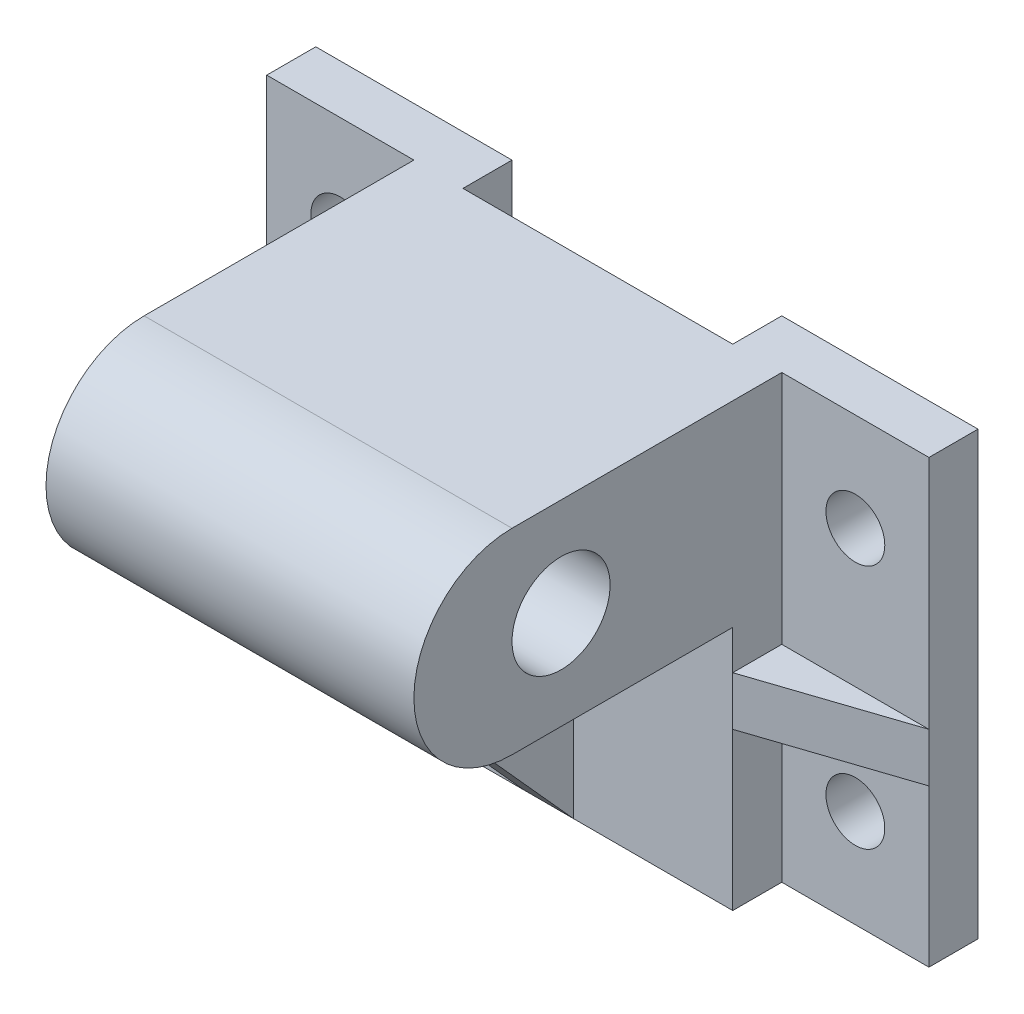
ISO-10303-21;
HEADER;
FILE_DESCRIPTION(('STEP AP214'),'2;1');
FILE_NAME('part.step','',(''),(''),'','','');
FILE_SCHEMA(('AUTOMOTIVE_DESIGN { 1 0 10303 214 1 1 1 1 }'));
ENDSEC;
DATA;
#1=APPLICATION_CONTEXT('core data for automotive mechanical design processes');
#2=APPLICATION_PROTOCOL_DEFINITION('international standard','automotive_design',2000,#1);
#3=PRODUCT_CONTEXT('',#1,'mechanical');
#4=PRODUCT('Part','Part','',(#3));
#5=PRODUCT_RELATED_PRODUCT_CATEGORY('part','',(#4));
#6=PRODUCT_DEFINITION_FORMATION('','',#4);
#7=PRODUCT_DEFINITION_CONTEXT('part definition',#1,'design');
#8=PRODUCT_DEFINITION('design','',#6,#7);
#9=PRODUCT_DEFINITION_SHAPE('','',#8);
#10=(LENGTH_UNIT() NAMED_UNIT(*) SI_UNIT(.MILLI.,.METRE.));
#11=(NAMED_UNIT(*) PLANE_ANGLE_UNIT() SI_UNIT($,.RADIAN.));
#12=(NAMED_UNIT(*) SI_UNIT($,.STERADIAN.) SOLID_ANGLE_UNIT());
#13=UNCERTAINTY_MEASURE_WITH_UNIT(LENGTH_MEASURE(1.E-05),#10,'distance_accuracy_value','');
#14=(GEOMETRIC_REPRESENTATION_CONTEXT(3) GLOBAL_UNCERTAINTY_ASSIGNED_CONTEXT((#13)) GLOBAL_UNIT_ASSIGNED_CONTEXT((#10,
#11,#12)) REPRESENTATION_CONTEXT('',''));
#15=CARTESIAN_POINT('',(0.,0.,0.));
#16=DIRECTION('',(0.,0.,1.));
#17=DIRECTION('',(1.,0.,0.));
#18=AXIS2_PLACEMENT_3D('',#15,#16,#17);
#19=CARTESIAN_POINT('',(-37.5,-45.,10.));
#20=DIRECTION('',(1.,0.,0.));
#21=DIRECTION('',(0.,0.,-1.));
#22=AXIS2_PLACEMENT_3D('',#19,#20,#21);
#23=PLANE('',#22);
#24=CARTESIAN_POINT('',(-37.5,25.,45.));
#25=DIRECTION('',(-1.,0.,0.));
#26=DIRECTION('',(0.,0.,1.));
#27=AXIS2_PLACEMENT_3D('',#24,#25,#26);
#28=CIRCLE('',#27,10.);
#29=CARTESIAN_POINT('',(-37.5,25.,55.));
#30=VERTEX_POINT('',#29);
#31=EDGE_CURVE('E297',#30,#30,#28,.T.);
#32=ORIENTED_EDGE('',*,*,#31,.F.);
#33=EDGE_LOOP('',(#32));
#34=FACE_BOUND('',#33,.T.);
#35=DIRECTION('',(0.,0.,-1.));
#36=VECTOR('',#35,1.);
#37=CARTESIAN_POINT('',(-37.5,-3.,10.));
#38=LINE('',#37,#36);
#39=CARTESIAN_POINT('',(-37.5,-3.00000000000002,10.));
#40=VERTEX_POINT('',#39);
#41=CARTESIAN_POINT('',(-37.5,-3.00000000000002,0.));
#42=VERTEX_POINT('',#41);
#43=EDGE_CURVE('E56',#40,#42,#38,.T.);
#44=ORIENTED_EDGE('',*,*,#43,.F.);
#45=DIRECTION('',(0.,-1.,0.));
#46=VECTOR('',#45,1.);
#47=CARTESIAN_POINT('',(-37.5,-45.,10.));
#48=LINE('',#47,#46);
#49=CARTESIAN_POINT('',(-37.5,4.99999999999998,10.));
#50=VERTEX_POINT('',#49);
#51=EDGE_CURVE('E393',#50,#40,#48,.T.);
#52=ORIENTED_EDGE('',*,*,#51,.F.);
#53=DIRECTION('',(0.,0.,-1.));
#54=VECTOR('',#53,1.);
#55=CARTESIAN_POINT('',(-37.5,5.,55.));
#56=LINE('',#55,#54);
#57=CARTESIAN_POINT('',(-37.5,5.,55.));
#58=VERTEX_POINT('',#57);
#59=EDGE_CURVE('E385',#58,#50,#56,.T.);
#60=ORIENTED_EDGE('',*,*,#59,.F.);
#61=CARTESIAN_POINT('',(-37.5,25.,55.));
#62=DIRECTION('',(-1.,0.,0.));
#63=DIRECTION('',(0.,0.,1.));
#64=AXIS2_PLACEMENT_3D('',#61,#62,#63);
#65=CIRCLE('',#64,20.);
#66=CARTESIAN_POINT('',(-37.5,45.,55.));
#67=VERTEX_POINT('',#66);
#68=EDGE_CURVE('E301',#58,#67,#65,.T.);
#69=ORIENTED_EDGE('',*,*,#68,.T.);
#70=DIRECTION('',(0.,0.,-1.));
#71=VECTOR('',#70,1.);
#72=CARTESIAN_POINT('',(-37.5,45.,10.));
#73=LINE('',#72,#71);
#74=CARTESIAN_POINT('',(-37.5,45.,0.));
#75=VERTEX_POINT('',#74);
#76=EDGE_CURVE('E41',#67,#75,#73,.T.);
#77=ORIENTED_EDGE('',*,*,#76,.T.);
#78=DIRECTION('',(0.,-1.,0.));
#79=VECTOR('',#78,1.);
#80=CARTESIAN_POINT('',(-37.5,-45.,0.));
#81=LINE('',#80,#79);
#82=EDGE_CURVE('E311',#75,#42,#81,.T.);
#83=ORIENTED_EDGE('',*,*,#82,.T.);
#84=EDGE_LOOP('',(#44,#52,#60,#69,#77,#83));
#85=FACE_BOUND('',#84,.T.);
#86=ADVANCED_FACE('F33',(#34,#85),#23,.F.);
#87=CARTESIAN_POINT('',(-67.5,-45.,0.));
#88=DIRECTION('',(0.,0.,1.));
#89=DIRECTION('',(0.,-1.,0.));
#90=AXIS2_PLACEMENT_3D('',#87,#88,#89);
#91=PLANE('',#90);
#92=CARTESIAN_POINT('',(-52.5,25.,0.));
#93=DIRECTION('',(0.,0.,1.));
#94=DIRECTION('',(1.,0.,0.));
#95=AXIS2_PLACEMENT_3D('',#92,#93,#94);
#96=CIRCLE('',#95,6.);
#97=CARTESIAN_POINT('',(-46.5,25.,0.));
#98=VERTEX_POINT('',#97);
#99=EDGE_CURVE('E277',#98,#98,#96,.T.);
#100=ORIENTED_EDGE('',*,*,#99,.F.);
#101=EDGE_LOOP('',(#100));
#102=FACE_BOUND('',#101,.T.);
#103=DIRECTION('',(0.,-1.,0.));
#104=VECTOR('',#103,1.);
#105=CARTESIAN_POINT('',(-67.5,-45.,0.));
#106=LINE('',#105,#104);
#107=CARTESIAN_POINT('',(-67.5,45.,0.));
#108=VERTEX_POINT('',#107);
#109=CARTESIAN_POINT('',(-67.5,-3.00000000000002,0.));
#110=VERTEX_POINT('',#109);
#111=EDGE_CURVE('E202',#108,#110,#106,.T.);
#112=ORIENTED_EDGE('',*,*,#111,.T.);
#113=DIRECTION('',(1.,0.,0.));
#114=VECTOR('',#113,1.);
#115=CARTESIAN_POINT('',(-67.5,-3.,0.));
#116=LINE('',#115,#114);
#117=EDGE_CURVE('E226',#110,#42,#116,.T.);
#118=ORIENTED_EDGE('',*,*,#117,.T.);
#119=ORIENTED_EDGE('',*,*,#82,.F.);
#120=DIRECTION('',(1.,0.,0.));
#121=VECTOR('',#120,1.);
#122=CARTESIAN_POINT('',(-67.5,45.,0.));
#123=LINE('',#122,#121);
#124=EDGE_CURVE('E316',#108,#75,#123,.T.);
#125=ORIENTED_EDGE('',*,*,#124,.F.);
#126=EDGE_LOOP('',(#112,#118,#119,#125));
#127=FACE_BOUND('',#126,.T.);
#128=ADVANCED_FACE('F417',(#102,#127),#91,.T.);
#129=CARTESIAN_POINT('',(37.5,-45.,10.));
#130=DIRECTION('',(-1.,0.,0.));
#131=DIRECTION('',(0.,0.,1.));
#132=AXIS2_PLACEMENT_3D('',#129,#130,#131);
#133=PLANE('',#132);
#134=CARTESIAN_POINT('',(37.5,25.,45.));
#135=DIRECTION('',(-1.,0.,0.));
#136=DIRECTION('',(0.,0.,1.));
#137=AXIS2_PLACEMENT_3D('',#134,#135,#136);
#138=CIRCLE('',#137,10.);
#139=CARTESIAN_POINT('',(37.5,25.,55.));
#140=VERTEX_POINT('',#139);
#141=EDGE_CURVE('E298',#140,#140,#138,.T.);
#142=ORIENTED_EDGE('',*,*,#141,.T.);
#143=EDGE_LOOP('',(#142));
#144=FACE_BOUND('',#143,.T.);
#145=DIRECTION('',(0.,0.,1.));
#146=VECTOR('',#145,1.);
#147=CARTESIAN_POINT('',(37.5,-3.,10.));
#148=LINE('',#147,#146);
#149=CARTESIAN_POINT('',(37.5,-3.,0.));
#150=VERTEX_POINT('',#149);
#151=CARTESIAN_POINT('',(37.5,-3.,10.));
#152=VERTEX_POINT('',#151);
#153=EDGE_CURVE('E238',#150,#152,#148,.T.);
#154=ORIENTED_EDGE('',*,*,#153,.F.);
#155=DIRECTION('',(0.,-1.,0.));
#156=VECTOR('',#155,1.);
#157=CARTESIAN_POINT('',(37.5,-45.,0.));
#158=LINE('',#157,#156);
#159=CARTESIAN_POINT('',(37.5,45.,0.));
#160=VERTEX_POINT('',#159);
#161=EDGE_CURVE('E325',#160,#150,#158,.T.);
#162=ORIENTED_EDGE('',*,*,#161,.F.);
#163=DIRECTION('',(0.,0.,-1.));
#164=VECTOR('',#163,1.);
#165=CARTESIAN_POINT('',(37.5,45.,10.));
#166=LINE('',#165,#164);
#167=CARTESIAN_POINT('',(37.5,45.,55.));
#168=VERTEX_POINT('',#167);
#169=EDGE_CURVE('E11',#168,#160,#166,.T.);
#170=ORIENTED_EDGE('',*,*,#169,.F.);
#171=CARTESIAN_POINT('',(37.5,25.,55.));
#172=DIRECTION('',(-1.,0.,0.));
#173=DIRECTION('',(0.,0.,1.));
#174=AXIS2_PLACEMENT_3D('',#171,#172,#173);
#175=CIRCLE('',#174,20.);
#176=CARTESIAN_POINT('',(37.5,5.,55.));
#177=VERTEX_POINT('',#176);
#178=EDGE_CURVE('E304',#177,#168,#175,.T.);
#179=ORIENTED_EDGE('',*,*,#178,.F.);
#180=DIRECTION('',(0.,0.,-1.));
#181=VECTOR('',#180,1.);
#182=CARTESIAN_POINT('',(37.5,5.,55.));
#183=LINE('',#182,#181);
#184=CARTESIAN_POINT('',(37.5,5.,10.));
#185=VERTEX_POINT('',#184);
#186=EDGE_CURVE('E379',#177,#185,#183,.T.);
#187=ORIENTED_EDGE('',*,*,#186,.T.);
#188=DIRECTION('',(0.,1.,0.));
#189=VECTOR('',#188,1.);
#190=CARTESIAN_POINT('',(37.5,-45.,10.));
#191=LINE('',#190,#189);
#192=EDGE_CURVE('E392',#152,#185,#191,.T.);
#193=ORIENTED_EDGE('',*,*,#192,.F.);
#194=EDGE_LOOP('',(#154,#162,#170,#179,#187,#193));
#195=FACE_BOUND('',#194,.T.);
#196=ADVANCED_FACE('F435',(#144,#195),#133,.F.);
#197=CARTESIAN_POINT('',(67.5,-45.,0.));
#198=DIRECTION('',(0.,0.,-1.));
#199=DIRECTION('',(0.,1.,0.));
#200=AXIS2_PLACEMENT_3D('',#197,#198,#199);
#201=PLANE('',#200);
#202=CARTESIAN_POINT('',(52.5,25.,0.));
#203=DIRECTION('',(0.,0.,1.));
#204=DIRECTION('',(1.,0.,0.));
#205=AXIS2_PLACEMENT_3D('',#202,#203,#204);
#206=CIRCLE('',#205,6.);
#207=CARTESIAN_POINT('',(58.5,25.,0.));
#208=VERTEX_POINT('',#207);
#209=EDGE_CURVE('E274',#208,#208,#206,.T.);
#210=ORIENTED_EDGE('',*,*,#209,.F.);
#211=EDGE_LOOP('',(#210));
#212=FACE_BOUND('',#211,.T.);
#213=DIRECTION('',(-1.,0.,0.));
#214=VECTOR('',#213,1.);
#215=CARTESIAN_POINT('',(67.5,-3.,0.));
#216=LINE('',#215,#214);
#217=CARTESIAN_POINT('',(67.5,-3.,0.));
#218=VERTEX_POINT('',#217);
#219=EDGE_CURVE('E242',#218,#150,#216,.T.);
#220=ORIENTED_EDGE('',*,*,#219,.F.);
#221=DIRECTION('',(0.,-1.,0.));
#222=VECTOR('',#221,1.);
#223=CARTESIAN_POINT('',(67.5,-45.,0.));
#224=LINE('',#223,#222);
#225=CARTESIAN_POINT('',(67.5,45.,0.));
#226=VERTEX_POINT('',#225);
#227=EDGE_CURVE('E328',#226,#218,#224,.T.);
#228=ORIENTED_EDGE('',*,*,#227,.F.);
#229=DIRECTION('',(-1.,0.,0.));
#230=VECTOR('',#229,1.);
#231=CARTESIAN_POINT('',(67.5,45.,0.));
#232=LINE('',#231,#230);
#233=EDGE_CURVE('E339',#226,#160,#232,.T.);
#234=ORIENTED_EDGE('',*,*,#233,.T.);
#235=ORIENTED_EDGE('',*,*,#161,.T.);
#236=EDGE_LOOP('',(#220,#228,#234,#235));
#237=FACE_BOUND('',#236,.T.);
#238=ADVANCED_FACE('F464',(#212,#237),#201,.F.);
#239=CARTESIAN_POINT('',(0.,0.,10.));
#240=DIRECTION('',(0.,0.,-1.));
#241=DIRECTION('',(-1.,0.,0.));
#242=AXIS2_PLACEMENT_3D('',#239,#240,#241);
#243=PLANE('',#242);
#244=CARTESIAN_POINT('',(37.5,-45.,10.));
#245=VERTEX_POINT('',#244);
#246=CARTESIAN_POINT('',(37.5,-13.,10.));
#247=VERTEX_POINT('',#246);
#248=EDGE_CURVE('E389',#245,#247,#191,.T.);
#249=ORIENTED_EDGE('',*,*,#248,.T.);
#250=DIRECTION('',(0.,1.,0.));
#251=VECTOR('',#250,1.);
#252=CARTESIAN_POINT('',(37.5,-45.,10.));
#253=LINE('',#252,#251);
#254=EDGE_CURVE('E253',#247,#152,#253,.T.);
#255=ORIENTED_EDGE('',*,*,#254,.T.);
#256=ORIENTED_EDGE('',*,*,#192,.T.);
#257=DIRECTION('',(1.,0.,0.));
#258=VECTOR('',#257,1.);
#259=CARTESIAN_POINT('',(-37.5,5.,10.));
#260=LINE('',#259,#258);
#261=CARTESIAN_POINT('',(5.,4.99999999999998,10.));
#262=VERTEX_POINT('',#261);
#263=EDGE_CURVE('E371',#262,#185,#260,.T.);
#264=ORIENTED_EDGE('',*,*,#263,.F.);
#265=DIRECTION('',(0.,1.,0.));
#266=VECTOR('',#265,1.);
#267=CARTESIAN_POINT('',(5.,0.,10.));
#268=LINE('',#267,#266);
#269=CARTESIAN_POINT('',(5.,-45.,10.));
#270=VERTEX_POINT('',#269);
#271=EDGE_CURVE('E260',#270,#262,#268,.T.);
#272=ORIENTED_EDGE('',*,*,#271,.F.);
#273=DIRECTION('',(1.,0.,0.));
#274=VECTOR('',#273,1.);
#275=CARTESIAN_POINT('',(-37.5,-45.,10.));
#276=LINE('',#275,#274);
#277=EDGE_CURVE('E395',#270,#245,#276,.T.);
#278=ORIENTED_EDGE('',*,*,#277,.T.);
#279=EDGE_LOOP('',(#249,#255,#256,#264,#272,#278));
#280=FACE_BOUND('',#279,.T.);
#281=ADVANCED_FACE('F455',(#280),#243,.F.);
#282=CARTESIAN_POINT('',(-37.5,5.,55.));
#283=DIRECTION('',(0.,1.,0.));
#284=DIRECTION('',(0.,0.,1.));
#285=AXIS2_PLACEMENT_3D('',#282,#283,#284);
#286=PLANE('',#285);
#287=DIRECTION('',(0.,0.,1.));
#288=VECTOR('',#287,1.);
#289=CARTESIAN_POINT('',(5.,5.,55.));
#290=LINE('',#289,#288);
#291=CARTESIAN_POINT('',(5.,5.,55.));
#292=VERTEX_POINT('',#291);
#293=EDGE_CURVE('E263',#262,#292,#290,.T.);
#294=ORIENTED_EDGE('',*,*,#293,.F.);
#295=ORIENTED_EDGE('',*,*,#263,.T.);
#296=ORIENTED_EDGE('',*,*,#186,.F.);
#297=DIRECTION('',(1.,0.,0.));
#298=VECTOR('',#297,1.);
#299=CARTESIAN_POINT('',(-37.5,5.,55.));
#300=LINE('',#299,#298);
#301=EDGE_CURVE('E377',#292,#177,#300,.T.);
#302=ORIENTED_EDGE('',*,*,#301,.F.);
#303=EDGE_LOOP('',(#294,#295,#296,#302));
#304=FACE_BOUND('',#303,.T.);
#305=ADVANCED_FACE('F463',(#304),#286,.F.);
#306=CARTESIAN_POINT('',(37.5,-13.,0.));
#307=VERTEX_POINT('',#306);
#308=CARTESIAN_POINT('',(37.5,-45.,0.));
#309=VERTEX_POINT('',#308);
#310=EDGE_CURVE('E321',#307,#309,#158,.T.);
#311=ORIENTED_EDGE('',*,*,#310,.F.);
#312=DIRECTION('',(0.,0.,1.));
#313=VECTOR('',#312,1.);
#314=CARTESIAN_POINT('',(37.5,-13.,10.));
#315=LINE('',#314,#313);
#316=EDGE_CURVE('E244',#307,#247,#315,.T.);
#317=ORIENTED_EDGE('',*,*,#316,.T.);
#318=ORIENTED_EDGE('',*,*,#248,.F.);
#319=DIRECTION('',(0.,0.,-1.));
#320=VECTOR('',#319,1.);
#321=CARTESIAN_POINT('',(37.5,-45.,10.));
#322=LINE('',#321,#320);
#323=EDGE_CURVE('E399',#245,#309,#322,.T.);
#324=ORIENTED_EDGE('',*,*,#323,.T.);
#325=EDGE_LOOP('',(#311,#317,#318,#324));
#326=FACE_BOUND('',#325,.T.);
#327=ADVANCED_FACE('F35',(#326),#133,.F.);
#328=CARTESIAN_POINT('',(0.,0.,0.));
#329=DIRECTION('',(0.,0.,-1.));
#330=DIRECTION('',(-1.,0.,0.));
#331=AXIS2_PLACEMENT_3D('',#328,#329,#330);
#332=PLANE('',#331);
#333=DIRECTION('',(1.,0.,0.));
#334=VECTOR('',#333,1.);
#335=CARTESIAN_POINT('',(-37.5,-45.,0.));
#336=LINE('',#335,#334);
#337=CARTESIAN_POINT('',(-27.5,-45.,0.));
#338=VERTEX_POINT('',#337);
#339=CARTESIAN_POINT('',(27.5,-45.,0.));
#340=VERTEX_POINT('',#339);
#341=EDGE_CURVE('E401',#338,#340,#336,.T.);
#342=ORIENTED_EDGE('',*,*,#341,.F.);
#343=DIRECTION('',(0.,-1.,0.));
#344=VECTOR('',#343,1.);
#345=CARTESIAN_POINT('',(-27.5,45.,0.));
#346=LINE('',#345,#344);
#347=CARTESIAN_POINT('',(-27.5,45.,0.));
#348=VERTEX_POINT('',#347);
#349=EDGE_CURVE('E342',#348,#338,#346,.T.);
#350=ORIENTED_EDGE('',*,*,#349,.F.);
#351=DIRECTION('',(-1.,0.,0.));
#352=VECTOR('',#351,1.);
#353=CARTESIAN_POINT('',(-37.5,45.,0.));
#354=LINE('',#353,#352);
#355=CARTESIAN_POINT('',(27.5,45.,0.));
#356=VERTEX_POINT('',#355);
#357=EDGE_CURVE('E388',#356,#348,#354,.T.);
#358=ORIENTED_EDGE('',*,*,#357,.F.);
#359=DIRECTION('',(0.,1.,0.));
#360=VECTOR('',#359,1.);
#361=CARTESIAN_POINT('',(27.5,45.,0.));
#362=LINE('',#361,#360);
#363=EDGE_CURVE('E356',#340,#356,#362,.T.);
#364=ORIENTED_EDGE('',*,*,#363,.F.);
#365=EDGE_LOOP('',(#342,#350,#358,#364));
#366=FACE_BOUND('',#365,.T.);
#367=ADVANCED_FACE('F452',(#366),#332,.T.);
#368=DIRECTION('',(0.,1.,0.));
#369=VECTOR('',#368,1.);
#370=CARTESIAN_POINT('',(-5.,0.,10.));
#371=LINE('',#370,#369);
#372=CARTESIAN_POINT('',(-5.,-45.,10.));
#373=VERTEX_POINT('',#372);
#374=CARTESIAN_POINT('',(-5.,4.99999999999998,10.));
#375=VERTEX_POINT('',#374);
#376=EDGE_CURVE('E266',#373,#375,#371,.T.);
#377=ORIENTED_EDGE('',*,*,#376,.T.);
#378=EDGE_CURVE('E380',#50,#375,#260,.T.);
#379=ORIENTED_EDGE('',*,*,#378,.F.);
#380=ORIENTED_EDGE('',*,*,#51,.T.);
#381=DIRECTION('',(0.,1.,0.));
#382=VECTOR('',#381,1.);
#383=CARTESIAN_POINT('',(-37.5,-45.,10.));
#384=LINE('',#383,#382);
#385=CARTESIAN_POINT('',(-37.5,-13.,10.));
#386=VERTEX_POINT('',#385);
#387=EDGE_CURVE('E223',#40,#386,#384,.F.);
#388=ORIENTED_EDGE('',*,*,#387,.T.);
#389=CARTESIAN_POINT('',(-37.5,-45.,10.));
#390=VERTEX_POINT('',#389);
#391=EDGE_CURVE('E48',#386,#390,#48,.T.);
#392=ORIENTED_EDGE('',*,*,#391,.T.);
#393=EDGE_CURVE('E396',#390,#373,#276,.T.);
#394=ORIENTED_EDGE('',*,*,#393,.T.);
#395=EDGE_LOOP('',(#377,#379,#380,#388,#392,#394));
#396=FACE_BOUND('',#395,.T.);
#397=ADVANCED_FACE('F448',(#396),#243,.F.);
#398=CARTESIAN_POINT('',(-37.5,45.,10.));
#399=DIRECTION('',(0.,-1.,0.));
#400=DIRECTION('',(0.,0.,-1.));
#401=AXIS2_PLACEMENT_3D('',#398,#399,#400);
#402=PLANE('',#401);
#403=ORIENTED_EDGE('',*,*,#76,.F.);
#404=DIRECTION('',(-1.,0.,0.));
#405=VECTOR('',#404,1.);
#406=CARTESIAN_POINT('',(-37.5,45.,55.));
#407=LINE('',#406,#405);
#408=EDGE_CURVE('E375',#168,#67,#407,.T.);
#409=ORIENTED_EDGE('',*,*,#408,.F.);
#410=ORIENTED_EDGE('',*,*,#169,.T.);
#411=ORIENTED_EDGE('',*,*,#233,.F.);
#412=DIRECTION('',(0.,0.,1.));
#413=VECTOR('',#412,1.);
#414=CARTESIAN_POINT('',(67.5,45.,-10.));
#415=LINE('',#414,#413);
#416=CARTESIAN_POINT('',(67.5,45.,-10.));
#417=VERTEX_POINT('',#416);
#418=EDGE_CURVE('E324',#417,#226,#415,.T.);
#419=ORIENTED_EDGE('',*,*,#418,.F.);
#420=DIRECTION('',(1.,0.,0.));
#421=VECTOR('',#420,1.);
#422=CARTESIAN_POINT('',(37.5,45.,-10.));
#423=LINE('',#422,#421);
#424=CARTESIAN_POINT('',(27.5,45.,-10.));
#425=VERTEX_POINT('',#424);
#426=EDGE_CURVE('E361',#425,#417,#423,.T.);
#427=ORIENTED_EDGE('',*,*,#426,.F.);
#428=DIRECTION('',(0.,0.,1.));
#429=VECTOR('',#428,1.);
#430=CARTESIAN_POINT('',(27.5,45.,-10.));
#431=LINE('',#430,#429);
#432=EDGE_CURVE('E364',#425,#356,#431,.T.);
#433=ORIENTED_EDGE('',*,*,#432,.T.);
#434=ORIENTED_EDGE('',*,*,#357,.T.);
#435=DIRECTION('',(0.,0.,1.));
#436=VECTOR('',#435,1.);
#437=CARTESIAN_POINT('',(-27.5,45.,-10.));
#438=LINE('',#437,#436);
#439=CARTESIAN_POINT('',(-27.5,45.,-10.));
#440=VERTEX_POINT('',#439);
#441=EDGE_CURVE('E353',#440,#348,#438,.T.);
#442=ORIENTED_EDGE('',*,*,#441,.F.);
#443=DIRECTION('',(1.,0.,0.));
#444=VECTOR('',#443,1.);
#445=CARTESIAN_POINT('',(-37.5,45.,-10.));
#446=LINE('',#445,#444);
#447=CARTESIAN_POINT('',(-67.5,45.,-10.));
#448=VERTEX_POINT('',#447);
#449=EDGE_CURVE('E343',#448,#440,#446,.T.);
#450=ORIENTED_EDGE('',*,*,#449,.F.);
#451=DIRECTION('',(0.,0.,1.));
#452=VECTOR('',#451,1.);
#453=CARTESIAN_POINT('',(-67.5,45.,-10.));
#454=LINE('',#453,#452);
#455=EDGE_CURVE('E313',#448,#108,#454,.T.);
#456=ORIENTED_EDGE('',*,*,#455,.T.);
#457=ORIENTED_EDGE('',*,*,#124,.T.);
#458=EDGE_LOOP('',(#403,#409,#410,#411,#419,#427,#433,#434,#442,#450,#456,#457));
#459=FACE_BOUND('',#458,.T.);
#460=ADVANCED_FACE('F413',(#459),#402,.F.);
#461=ORIENTED_EDGE('',*,*,#391,.F.);
#462=DIRECTION('',(0.,0.,-1.));
#463=VECTOR('',#462,1.);
#464=CARTESIAN_POINT('',(-37.5,-13.,10.));
#465=LINE('',#464,#463);
#466=CARTESIAN_POINT('',(-37.5,-13.,0.));
#467=VERTEX_POINT('',#466);
#468=EDGE_CURVE('E213',#386,#467,#465,.T.);
#469=ORIENTED_EDGE('',*,*,#468,.T.);
#470=CARTESIAN_POINT('',(-37.5,-45.,0.));
#471=VERTEX_POINT('',#470);
#472=EDGE_CURVE('E209',#467,#471,#81,.T.);
#473=ORIENTED_EDGE('',*,*,#472,.T.);
#474=DIRECTION('',(0.,0.,-1.));
#475=VECTOR('',#474,1.);
#476=CARTESIAN_POINT('',(-37.5,-45.,10.));
#477=LINE('',#476,#475);
#478=EDGE_CURVE('E405',#390,#471,#477,.T.);
#479=ORIENTED_EDGE('',*,*,#478,.F.);
#480=EDGE_LOOP('',(#461,#469,#473,#479));
#481=FACE_BOUND('',#480,.T.);
#482=ADVANCED_FACE('F431',(#481),#23,.F.);
#483=CARTESIAN_POINT('',(-37.5,-45.,10.));
#484=DIRECTION('',(0.,1.,0.));
#485=DIRECTION('',(0.,0.,1.));
#486=AXIS2_PLACEMENT_3D('',#483,#484,#485);
#487=PLANE('',#486);
#488=ORIENTED_EDGE('',*,*,#341,.T.);
#489=DIRECTION('',(0.,0.,1.));
#490=VECTOR('',#489,1.);
#491=CARTESIAN_POINT('',(27.5,-45.,-10.));
#492=LINE('',#491,#490);
#493=CARTESIAN_POINT('',(27.5,-45.,-10.));
#494=VERTEX_POINT('',#493);
#495=EDGE_CURVE('E368',#494,#340,#492,.T.);
#496=ORIENTED_EDGE('',*,*,#495,.F.);
#497=DIRECTION('',(-1.,0.,0.));
#498=VECTOR('',#497,1.);
#499=CARTESIAN_POINT('',(37.5,-45.,-10.));
#500=LINE('',#499,#498);
#501=CARTESIAN_POINT('',(67.5,-45.,-10.));
#502=VERTEX_POINT('',#501);
#503=EDGE_CURVE('E357',#502,#494,#500,.T.);
#504=ORIENTED_EDGE('',*,*,#503,.F.);
#505=DIRECTION('',(0.,0.,-1.));
#506=VECTOR('',#505,1.);
#507=CARTESIAN_POINT('',(67.5,-45.,-10.));
#508=LINE('',#507,#506);
#509=CARTESIAN_POINT('',(67.5,-45.,0.));
#510=VERTEX_POINT('',#509);
#511=EDGE_CURVE('E331',#510,#502,#508,.T.);
#512=ORIENTED_EDGE('',*,*,#511,.F.);
#513=DIRECTION('',(-1.,0.,0.));
#514=VECTOR('',#513,1.);
#515=CARTESIAN_POINT('',(67.5,-45.,0.));
#516=LINE('',#515,#514);
#517=EDGE_CURVE('E334',#510,#309,#516,.T.);
#518=ORIENTED_EDGE('',*,*,#517,.T.);
#519=ORIENTED_EDGE('',*,*,#323,.F.);
#520=ORIENTED_EDGE('',*,*,#277,.F.);
#521=DIRECTION('',(1.,0.,0.));
#522=VECTOR('',#521,1.);
#523=CARTESIAN_POINT('',(-37.5,-45.,10.));
#524=LINE('',#523,#522);
#525=EDGE_CURVE('E271',#373,#270,#524,.T.);
#526=ORIENTED_EDGE('',*,*,#525,.F.);
#527=ORIENTED_EDGE('',*,*,#393,.F.);
#528=ORIENTED_EDGE('',*,*,#478,.T.);
#529=DIRECTION('',(1.,0.,0.));
#530=VECTOR('',#529,1.);
#531=CARTESIAN_POINT('',(-67.5,-45.,0.));
#532=LINE('',#531,#530);
#533=CARTESIAN_POINT('',(-67.5,-45.,0.));
#534=VERTEX_POINT('',#533);
#535=EDGE_CURVE('E319',#534,#471,#532,.T.);
#536=ORIENTED_EDGE('',*,*,#535,.F.);
#537=DIRECTION('',(0.,0.,-1.));
#538=VECTOR('',#537,1.);
#539=CARTESIAN_POINT('',(-67.5,-45.,-10.));
#540=LINE('',#539,#538);
#541=CARTESIAN_POINT('',(-67.5,-45.,-10.));
#542=VERTEX_POINT('',#541);
#543=EDGE_CURVE('E198',#534,#542,#540,.T.);
#544=ORIENTED_EDGE('',*,*,#543,.T.);
#545=DIRECTION('',(-1.,0.,0.));
#546=VECTOR('',#545,1.);
#547=CARTESIAN_POINT('',(-37.5,-45.,-10.));
#548=LINE('',#547,#546);
#549=CARTESIAN_POINT('',(-27.5,-45.,-10.));
#550=VERTEX_POINT('',#549);
#551=EDGE_CURVE('E347',#550,#542,#548,.T.);
#552=ORIENTED_EDGE('',*,*,#551,.F.);
#553=DIRECTION('',(0.,0.,1.));
#554=VECTOR('',#553,1.);
#555=CARTESIAN_POINT('',(-27.5,-45.,-10.));
#556=LINE('',#555,#554);
#557=EDGE_CURVE('E349',#550,#338,#556,.T.);
#558=ORIENTED_EDGE('',*,*,#557,.T.);
#559=EDGE_LOOP('',(#488,#496,#504,#512,#518,#519,#520,#526,#527,#528,#536,#544,#552,#558));
#560=FACE_BOUND('',#559,.T.);
#561=ADVANCED_FACE('F441',(#560),#487,.F.);
#562=ORIENTED_EDGE('',*,*,#378,.T.);
#563=DIRECTION('',(0.,0.,1.));
#564=VECTOR('',#563,1.);
#565=CARTESIAN_POINT('',(-5.,5.,55.));
#566=LINE('',#565,#564);
#567=CARTESIAN_POINT('',(-5.,5.00000000000001,55.));
#568=VERTEX_POINT('',#567);
#569=EDGE_CURVE('E268',#375,#568,#566,.T.);
#570=ORIENTED_EDGE('',*,*,#569,.T.);
#571=EDGE_CURVE('E372',#58,#568,#300,.T.);
#572=ORIENTED_EDGE('',*,*,#571,.F.);
#573=ORIENTED_EDGE('',*,*,#59,.T.);
#574=EDGE_LOOP('',(#562,#570,#572,#573));
#575=FACE_BOUND('',#574,.T.);
#576=ADVANCED_FACE('F446',(#575),#286,.F.);
#577=CARTESIAN_POINT('',(27.5,45.,-10.));
#578=DIRECTION('',(1.,0.,0.));
#579=DIRECTION('',(0.,1.,0.));
#580=AXIS2_PLACEMENT_3D('',#577,#578,#579);
#581=PLANE('',#580);
#582=ORIENTED_EDGE('',*,*,#363,.T.);
#583=ORIENTED_EDGE('',*,*,#432,.F.);
#584=DIRECTION('',(0.,1.,0.));
#585=VECTOR('',#584,1.);
#586=CARTESIAN_POINT('',(27.5,45.,-10.));
#587=LINE('',#586,#585);
#588=EDGE_CURVE('E359',#494,#425,#587,.T.);
#589=ORIENTED_EDGE('',*,*,#588,.F.);
#590=ORIENTED_EDGE('',*,*,#495,.T.);
#591=EDGE_LOOP('',(#582,#583,#589,#590));
#592=FACE_BOUND('',#591,.T.);
#593=ADVANCED_FACE('F512',(#592),#581,.F.);
#594=CARTESIAN_POINT('',(0.,0.,-10.));
#595=DIRECTION('',(0.,0.,-1.));
#596=DIRECTION('',(-1.,0.,0.));
#597=AXIS2_PLACEMENT_3D('',#594,#595,#596);
#598=PLANE('',#597);
#599=ORIENTED_EDGE('',*,*,#588,.T.);
#600=ORIENTED_EDGE('',*,*,#426,.T.);
#601=DIRECTION('',(0.,1.,0.));
#602=VECTOR('',#601,1.);
#603=CARTESIAN_POINT('',(67.5,-45.,-10.));
#604=LINE('',#603,#602);
#605=EDGE_CURVE('E322',#502,#417,#604,.T.);
#606=ORIENTED_EDGE('',*,*,#605,.F.);
#607=ORIENTED_EDGE('',*,*,#503,.T.);
#608=EDGE_LOOP('',(#599,#600,#606,#607));
#609=FACE_BOUND('',#608,.T.);
#610=CARTESIAN_POINT('',(52.5,-25.,-9.99999999999999));
#611=DIRECTION('',(0.,0.,-1.));
#612=DIRECTION('',(-1.,0.,0.));
#613=AXIS2_PLACEMENT_3D('',#610,#611,#612);
#614=CIRCLE('',#613,6.);
#615=CARTESIAN_POINT('',(46.5,-25.,-9.99999999999999));
#616=VERTEX_POINT('',#615);
#617=EDGE_CURVE('E294',#616,#616,#614,.T.);
#618=ORIENTED_EDGE('',*,*,#617,.F.);
#619=EDGE_LOOP('',(#618));
#620=FACE_BOUND('',#619,.T.);
#621=CARTESIAN_POINT('',(52.5,25.,-9.99999999999999));
#622=DIRECTION('',(0.,0.,-1.));
#623=DIRECTION('',(-1.,0.,0.));
#624=AXIS2_PLACEMENT_3D('',#621,#622,#623);
#625=CIRCLE('',#624,6.);
#626=CARTESIAN_POINT('',(46.5,25.,-9.99999999999999));
#627=VERTEX_POINT('',#626);
#628=EDGE_CURVE('E291',#627,#627,#625,.T.);
#629=ORIENTED_EDGE('',*,*,#628,.F.);
#630=EDGE_LOOP('',(#629));
#631=FACE_BOUND('',#630,.T.);
#632=ADVANCED_FACE('F506',(#609,#620,#631),#598,.T.);
#633=CARTESIAN_POINT('',(-27.5,45.,-10.));
#634=DIRECTION('',(-1.,0.,0.));
#635=DIRECTION('',(0.,-1.,0.));
#636=AXIS2_PLACEMENT_3D('',#633,#634,#635);
#637=PLANE('',#636);
#638=ORIENTED_EDGE('',*,*,#557,.F.);
#639=DIRECTION('',(0.,-1.,0.));
#640=VECTOR('',#639,1.);
#641=CARTESIAN_POINT('',(-27.5,45.,-10.));
#642=LINE('',#641,#640);
#643=EDGE_CURVE('E345',#440,#550,#642,.T.);
#644=ORIENTED_EDGE('',*,*,#643,.F.);
#645=ORIENTED_EDGE('',*,*,#441,.T.);
#646=ORIENTED_EDGE('',*,*,#349,.T.);
#647=EDGE_LOOP('',(#638,#644,#645,#646));
#648=FACE_BOUND('',#647,.T.);
#649=ADVANCED_FACE('F520',(#648),#637,.F.);
#650=CARTESIAN_POINT('',(0.,0.,-10.));
#651=DIRECTION('',(0.,0.,1.));
#652=DIRECTION('',(1.,0.,0.));
#653=AXIS2_PLACEMENT_3D('',#650,#651,#652);
#654=PLANE('',#653);
#655=CARTESIAN_POINT('',(-52.5,-25.,-9.99999999999999));
#656=DIRECTION('',(0.,0.,1.));
#657=DIRECTION('',(1.,0.,0.));
#658=AXIS2_PLACEMENT_3D('',#655,#656,#657);
#659=CIRCLE('',#658,6.);
#660=CARTESIAN_POINT('',(-46.5,-25.,-9.99999999999999));
#661=VERTEX_POINT('',#660);
#662=EDGE_CURVE('E288',#661,#661,#659,.T.);
#663=ORIENTED_EDGE('',*,*,#662,.T.);
#664=EDGE_LOOP('',(#663));
#665=FACE_BOUND('',#664,.T.);
#666=DIRECTION('',(0.,1.,0.));
#667=VECTOR('',#666,1.);
#668=CARTESIAN_POINT('',(-67.5,-45.,-10.));
#669=LINE('',#668,#667);
#670=EDGE_CURVE('E309',#542,#448,#669,.T.);
#671=ORIENTED_EDGE('',*,*,#670,.T.);
#672=ORIENTED_EDGE('',*,*,#449,.T.);
#673=ORIENTED_EDGE('',*,*,#643,.T.);
#674=ORIENTED_EDGE('',*,*,#551,.T.);
#675=EDGE_LOOP('',(#671,#672,#673,#674));
#676=FACE_BOUND('',#675,.T.);
#677=CARTESIAN_POINT('',(-52.5,25.,-9.99999999999999));
#678=DIRECTION('',(0.,0.,1.));
#679=DIRECTION('',(1.,0.,0.));
#680=AXIS2_PLACEMENT_3D('',#677,#678,#679);
#681=CIRCLE('',#680,6.);
#682=CARTESIAN_POINT('',(-46.5,25.,-9.99999999999999));
#683=VERTEX_POINT('',#682);
#684=EDGE_CURVE('E285',#683,#683,#681,.T.);
#685=ORIENTED_EDGE('',*,*,#684,.T.);
#686=EDGE_LOOP('',(#685));
#687=FACE_BOUND('',#686,.T.);
#688=ADVANCED_FACE('F524',(#665,#676,#687),#654,.F.);
#689=CARTESIAN_POINT('',(52.5,-25.,0.));
#690=DIRECTION('',(0.,0.,1.));
#691=DIRECTION('',(-1.,0.,0.));
#692=AXIS2_PLACEMENT_3D('',#689,#690,#691);
#693=CIRCLE('',#692,6.);
#694=CARTESIAN_POINT('',(46.5,-25.,0.));
#695=VERTEX_POINT('',#694);
#696=EDGE_CURVE('E278',#695,#695,#693,.T.);
#697=ORIENTED_EDGE('',*,*,#696,.F.);
#698=EDGE_LOOP('',(#697));
#699=FACE_BOUND('',#698,.T.);
#700=CARTESIAN_POINT('',(67.5,-13.,0.));
#701=VERTEX_POINT('',#700);
#702=EDGE_CURVE('E327',#701,#510,#224,.T.);
#703=ORIENTED_EDGE('',*,*,#702,.F.);
#704=DIRECTION('',(-1.,0.,0.));
#705=VECTOR('',#704,1.);
#706=CARTESIAN_POINT('',(67.5,-13.,0.));
#707=LINE('',#706,#705);
#708=EDGE_CURVE('E247',#701,#307,#707,.T.);
#709=ORIENTED_EDGE('',*,*,#708,.T.);
#710=ORIENTED_EDGE('',*,*,#310,.T.);
#711=ORIENTED_EDGE('',*,*,#517,.F.);
#712=EDGE_LOOP('',(#703,#709,#710,#711));
#713=FACE_BOUND('',#712,.T.);
#714=ADVANCED_FACE('F473',(#699,#713),#201,.F.);
#715=CARTESIAN_POINT('',(67.5,0.,0.));
#716=DIRECTION('',(1.,0.,0.));
#717=DIRECTION('',(0.,0.,-1.));
#718=AXIS2_PLACEMENT_3D('',#715,#716,#717);
#719=PLANE('',#718);
#720=ORIENTED_EDGE('',*,*,#605,.T.);
#721=ORIENTED_EDGE('',*,*,#418,.T.);
#722=ORIENTED_EDGE('',*,*,#227,.T.);
#723=DIRECTION('',(0.,-1.,0.));
#724=VECTOR('',#723,1.);
#725=CARTESIAN_POINT('',(67.5,0.,0.));
#726=LINE('',#725,#724);
#727=EDGE_CURVE('E250',#218,#701,#726,.T.);
#728=ORIENTED_EDGE('',*,*,#727,.T.);
#729=ORIENTED_EDGE('',*,*,#702,.T.);
#730=ORIENTED_EDGE('',*,*,#511,.T.);
#731=EDGE_LOOP('',(#720,#721,#722,#728,#729,#730));
#732=FACE_BOUND('',#731,.T.);
#733=ADVANCED_FACE('F488',(#732),#719,.T.);
#734=DIRECTION('',(1.,0.,0.));
#735=VECTOR('',#734,1.);
#736=CARTESIAN_POINT('',(-67.5,-13.,0.));
#737=LINE('',#736,#735);
#738=CARTESIAN_POINT('',(-67.5,-13.,0.));
#739=VERTEX_POINT('',#738);
#740=EDGE_CURVE('E206',#739,#467,#737,.T.);
#741=ORIENTED_EDGE('',*,*,#740,.F.);
#742=EDGE_CURVE('E189',#739,#534,#106,.T.);
#743=ORIENTED_EDGE('',*,*,#742,.T.);
#744=ORIENTED_EDGE('',*,*,#535,.T.);
#745=ORIENTED_EDGE('',*,*,#472,.F.);
#746=EDGE_LOOP('',(#741,#743,#744,#745));
#747=FACE_BOUND('',#746,.T.);
#748=CARTESIAN_POINT('',(-52.5,-25.,0.));
#749=DIRECTION('',(0.,0.,1.));
#750=DIRECTION('',(-1.,0.,0.));
#751=AXIS2_PLACEMENT_3D('',#748,#749,#750);
#752=CIRCLE('',#751,6.);
#753=CARTESIAN_POINT('',(-58.5,-25.,0.));
#754=VERTEX_POINT('',#753);
#755=EDGE_CURVE('E273',#754,#754,#752,.T.);
#756=ORIENTED_EDGE('',*,*,#755,.F.);
#757=EDGE_LOOP('',(#756));
#758=FACE_BOUND('',#757,.T.);
#759=ADVANCED_FACE('F207',(#747,#758),#91,.T.);
#760=CARTESIAN_POINT('',(-67.5,0.,0.));
#761=DIRECTION('',(-1.,0.,0.));
#762=DIRECTION('',(0.,0.,-1.));
#763=AXIS2_PLACEMENT_3D('',#760,#761,#762);
#764=PLANE('',#763);
#765=ORIENTED_EDGE('',*,*,#742,.F.);
#766=DIRECTION('',(0.,-1.,0.));
#767=VECTOR('',#766,1.);
#768=CARTESIAN_POINT('',(-67.5,0.,0.));
#769=LINE('',#768,#767);
#770=EDGE_CURVE('E194',#739,#110,#769,.F.);
#771=ORIENTED_EDGE('',*,*,#770,.T.);
#772=ORIENTED_EDGE('',*,*,#111,.F.);
#773=ORIENTED_EDGE('',*,*,#455,.F.);
#774=ORIENTED_EDGE('',*,*,#670,.F.);
#775=ORIENTED_EDGE('',*,*,#543,.F.);
#776=EDGE_LOOP('',(#765,#771,#772,#773,#774,#775));
#777=FACE_BOUND('',#776,.T.);
#778=ADVANCED_FACE('F191',(#777),#764,.T.);
#779=CARTESIAN_POINT('',(37.5,25.,55.));
#780=DIRECTION('',(-1.,0.,0.));
#781=DIRECTION('',(0.,0.,1.));
#782=AXIS2_PLACEMENT_3D('',#779,#780,#781);
#783=CYLINDRICAL_SURFACE('',#782,20.);
#784=ORIENTED_EDGE('',*,*,#408,.T.);
#785=ORIENTED_EDGE('',*,*,#68,.F.);
#786=ORIENTED_EDGE('',*,*,#571,.T.);
#787=EDGE_CURVE('E376',#568,#292,#300,.T.);
#788=ORIENTED_EDGE('',*,*,#787,.T.);
#789=ORIENTED_EDGE('',*,*,#301,.T.);
#790=ORIENTED_EDGE('',*,*,#178,.T.);
#791=EDGE_LOOP('',(#784,#785,#786,#788,#789,#790));
#792=FACE_BOUND('',#791,.T.);
#793=ADVANCED_FACE('F544',(#792),#783,.T.);
#794=CARTESIAN_POINT('',(37.5,25.,45.));
#795=DIRECTION('',(-1.,0.,0.));
#796=DIRECTION('',(0.,0.,1.));
#797=AXIS2_PLACEMENT_3D('',#794,#795,#796);
#798=CYLINDRICAL_SURFACE('',#797,10.);
#799=ORIENTED_EDGE('',*,*,#31,.T.);
#800=EDGE_LOOP('',(#799));
#801=FACE_BOUND('',#800,.T.);
#802=ORIENTED_EDGE('',*,*,#141,.F.);
#803=EDGE_LOOP('',(#802));
#804=FACE_BOUND('',#803,.T.);
#805=ADVANCED_FACE('F534',(#801,#804),#798,.F.);
#806=CARTESIAN_POINT('',(-52.5,25.,-75.));
#807=DIRECTION('',(0.,0.,1.));
#808=DIRECTION('',(1.,0.,0.));
#809=AXIS2_PLACEMENT_3D('',#806,#807,#808);
#810=CYLINDRICAL_SURFACE('',#809,6.);
#811=ORIENTED_EDGE('',*,*,#99,.T.);
#812=EDGE_LOOP('',(#811));
#813=FACE_BOUND('',#812,.T.);
#814=ORIENTED_EDGE('',*,*,#684,.F.);
#815=EDGE_LOOP('',(#814));
#816=FACE_BOUND('',#815,.T.);
#817=ADVANCED_FACE('F531',(#813,#816),#810,.F.);
#818=CARTESIAN_POINT('',(-52.5,-25.,-75.));
#819=DIRECTION('',(0.,0.,1.));
#820=DIRECTION('',(1.,0.,0.));
#821=AXIS2_PLACEMENT_3D('',#818,#819,#820);
#822=CYLINDRICAL_SURFACE('',#821,6.);
#823=ORIENTED_EDGE('',*,*,#755,.T.);
#824=EDGE_LOOP('',(#823));
#825=FACE_BOUND('',#824,.T.);
#826=ORIENTED_EDGE('',*,*,#662,.F.);
#827=EDGE_LOOP('',(#826));
#828=FACE_BOUND('',#827,.T.);
#829=ADVANCED_FACE('F533',(#825,#828),#822,.F.);
#830=CARTESIAN_POINT('',(52.5,25.,-75.));
#831=DIRECTION('',(0.,0.,1.));
#832=DIRECTION('',(1.,0.,0.));
#833=AXIS2_PLACEMENT_3D('',#830,#831,#832);
#834=CYLINDRICAL_SURFACE('',#833,6.);
#835=ORIENTED_EDGE('',*,*,#628,.T.);
#836=EDGE_LOOP('',(#835));
#837=FACE_BOUND('',#836,.T.);
#838=ORIENTED_EDGE('',*,*,#209,.T.);
#839=EDGE_LOOP('',(#838));
#840=FACE_BOUND('',#839,.T.);
#841=ADVANCED_FACE('F541',(#837,#840),#834,.F.);
#842=CARTESIAN_POINT('',(52.5,-25.,-75.));
#843=DIRECTION('',(0.,0.,1.));
#844=DIRECTION('',(1.,0.,0.));
#845=AXIS2_PLACEMENT_3D('',#842,#843,#844);
#846=CYLINDRICAL_SURFACE('',#845,6.);
#847=ORIENTED_EDGE('',*,*,#617,.T.);
#848=EDGE_LOOP('',(#847));
#849=FACE_BOUND('',#848,.T.);
#850=ORIENTED_EDGE('',*,*,#696,.T.);
#851=EDGE_LOOP('',(#850));
#852=FACE_BOUND('',#851,.T.);
#853=ADVANCED_FACE('F592',(#849,#852),#846,.F.);
#854=CARTESIAN_POINT('',(-5.,0.,32.5));
#855=DIRECTION('',(-1.,0.,0.));
#856=DIRECTION('',(0.,0.,1.));
#857=AXIS2_PLACEMENT_3D('',#854,#855,#856);
#858=PLANE('',#857);
#859=ORIENTED_EDGE('',*,*,#569,.F.);
#860=ORIENTED_EDGE('',*,*,#376,.F.);
#861=DIRECTION('',(0.,0.743294146247166,0.66896473162245));
#862=VECTOR('',#861,1.);
#863=CARTESIAN_POINT('',(-5.,-45.,10.));
#864=LINE('',#863,#862);
#865=EDGE_CURVE('E257',#373,#568,#864,.T.);
#866=ORIENTED_EDGE('',*,*,#865,.T.);
#867=EDGE_LOOP('',(#859,#860,#866));
#868=FACE_BOUND('',#867,.T.);
#869=ADVANCED_FACE('F585',(#868),#858,.T.);
#870=CARTESIAN_POINT('',(5.,0.,32.5));
#871=DIRECTION('',(-1.,0.,0.));
#872=DIRECTION('',(0.,0.,1.));
#873=AXIS2_PLACEMENT_3D('',#870,#871,#872);
#874=PLANE('',#873);
#875=ORIENTED_EDGE('',*,*,#271,.T.);
#876=ORIENTED_EDGE('',*,*,#293,.T.);
#877=DIRECTION('',(0.,0.743294146247166,0.66896473162245));
#878=VECTOR('',#877,1.);
#879=CARTESIAN_POINT('',(5.,-45.,10.));
#880=LINE('',#879,#878);
#881=EDGE_CURVE('E256',#270,#292,#880,.T.);
#882=ORIENTED_EDGE('',*,*,#881,.F.);
#883=EDGE_LOOP('',(#875,#876,#882));
#884=FACE_BOUND('',#883,.T.);
#885=ADVANCED_FACE('F583',(#884),#874,.F.);
#886=CARTESIAN_POINT('',(0.,-45.,10.));
#887=DIRECTION('',(0.,-0.66896473162245,0.743294146247166));
#888=DIRECTION('',(0.,0.743294146247166,0.66896473162245));
#889=AXIS2_PLACEMENT_3D('',#886,#887,#888);
#890=PLANE('',#889);
#891=ORIENTED_EDGE('',*,*,#865,.F.);
#892=ORIENTED_EDGE('',*,*,#525,.T.);
#893=ORIENTED_EDGE('',*,*,#881,.T.);
#894=ORIENTED_EDGE('',*,*,#787,.F.);
#895=EDGE_LOOP('',(#891,#892,#893,#894));
#896=FACE_BOUND('',#895,.T.);
#897=ADVANCED_FACE('F582',(#896),#890,.T.);
#898=CARTESIAN_POINT('',(67.5,-8.,0.));
#899=DIRECTION('',(0.316227766016838,0.,0.948683298050514));
#900=DIRECTION('',(-0.948683298050514,0.,0.316227766016838));
#901=AXIS2_PLACEMENT_3D('',#898,#899,#900);
#902=PLANE('',#901);
#903=ORIENTED_EDGE('',*,*,#254,.F.);
#904=DIRECTION('',(-0.948683298050514,0.,0.316227766016838));
#905=VECTOR('',#904,1.);
#906=CARTESIAN_POINT('',(67.5,-13.,0.));
#907=LINE('',#906,#905);
#908=EDGE_CURVE('E235',#701,#247,#907,.T.);
#909=ORIENTED_EDGE('',*,*,#908,.F.);
#910=ORIENTED_EDGE('',*,*,#727,.F.);
#911=DIRECTION('',(-0.948683298050514,0.,0.316227766016838));
#912=VECTOR('',#911,1.);
#913=CARTESIAN_POINT('',(67.5,-3.,0.));
#914=LINE('',#913,#912);
#915=EDGE_CURVE('E234',#218,#152,#914,.T.);
#916=ORIENTED_EDGE('',*,*,#915,.T.);
#917=EDGE_LOOP('',(#903,#909,#910,#916));
#918=FACE_BOUND('',#917,.T.);
#919=ADVANCED_FACE('F492',(#918),#902,.T.);
#920=CARTESIAN_POINT('',(0.,-13.,32.5));
#921=DIRECTION('',(0.,-1.,0.));
#922=DIRECTION('',(0.,0.,-1.));
#923=AXIS2_PLACEMENT_3D('',#920,#921,#922);
#924=PLANE('',#923);
#925=ORIENTED_EDGE('',*,*,#708,.F.);
#926=ORIENTED_EDGE('',*,*,#908,.T.);
#927=ORIENTED_EDGE('',*,*,#316,.F.);
#928=EDGE_LOOP('',(#925,#926,#927));
#929=FACE_BOUND('',#928,.T.);
#930=ADVANCED_FACE('F482',(#929),#924,.T.);
#931=CARTESIAN_POINT('',(0.,-3.,32.5));
#932=DIRECTION('',(0.,-1.,0.));
#933=DIRECTION('',(0.,0.,-1.));
#934=AXIS2_PLACEMENT_3D('',#931,#932,#933);
#935=PLANE('',#934);
#936=ORIENTED_EDGE('',*,*,#915,.F.);
#937=ORIENTED_EDGE('',*,*,#219,.T.);
#938=ORIENTED_EDGE('',*,*,#153,.T.);
#939=EDGE_LOOP('',(#936,#937,#938));
#940=FACE_BOUND('',#939,.T.);
#941=ADVANCED_FACE('F496',(#940),#935,.F.);
#942=CARTESIAN_POINT('',(-67.5,-8.,0.));
#943=DIRECTION('',(0.316227766016838,0.,-0.948683298050514));
#944=DIRECTION('',(0.948683298050514,0.,0.316227766016838));
#945=AXIS2_PLACEMENT_3D('',#942,#943,#944);
#946=PLANE('',#945);
#947=ORIENTED_EDGE('',*,*,#387,.F.);
#948=DIRECTION('',(0.948683298050514,0.,0.316227766016838));
#949=VECTOR('',#948,1.);
#950=CARTESIAN_POINT('',(-67.5,-3.,0.));
#951=LINE('',#950,#949);
#952=EDGE_CURVE('E222',#110,#40,#951,.T.);
#953=ORIENTED_EDGE('',*,*,#952,.F.);
#954=ORIENTED_EDGE('',*,*,#770,.F.);
#955=DIRECTION('',(0.948683298050514,0.,0.316227766016838));
#956=VECTOR('',#955,1.);
#957=CARTESIAN_POINT('',(-67.5,-13.,0.));
#958=LINE('',#957,#956);
#959=EDGE_CURVE('E220',#739,#386,#958,.T.);
#960=ORIENTED_EDGE('',*,*,#959,.T.);
#961=EDGE_LOOP('',(#947,#953,#954,#960));
#962=FACE_BOUND('',#961,.T.);
#963=ADVANCED_FACE('F219',(#962),#946,.F.);
#964=CARTESIAN_POINT('',(0.,-13.,32.5));
#965=DIRECTION('',(0.,-1.,0.));
#966=DIRECTION('',(0.,0.,-1.));
#967=AXIS2_PLACEMENT_3D('',#964,#965,#966);
#968=PLANE('',#967);
#969=ORIENTED_EDGE('',*,*,#468,.F.);
#970=ORIENTED_EDGE('',*,*,#959,.F.);
#971=ORIENTED_EDGE('',*,*,#740,.T.);
#972=EDGE_LOOP('',(#969,#970,#971));
#973=FACE_BOUND('',#972,.T.);
#974=ADVANCED_FACE('F225',(#973),#968,.T.);
#975=CARTESIAN_POINT('',(0.,-3.,32.5));
#976=DIRECTION('',(0.,-1.,0.));
#977=DIRECTION('',(0.,0.,-1.));
#978=AXIS2_PLACEMENT_3D('',#975,#976,#977);
#979=PLANE('',#978);
#980=ORIENTED_EDGE('',*,*,#952,.T.);
#981=ORIENTED_EDGE('',*,*,#43,.T.);
#982=ORIENTED_EDGE('',*,*,#117,.F.);
#983=EDGE_LOOP('',(#980,#981,#982));
#984=FACE_BOUND('',#983,.T.);
#985=ADVANCED_FACE('F420',(#984),#979,.F.);
#986=CLOSED_SHELL('',(#86,#128,#196,#238,#281,#305,#327,#367,#397,#460,#482,#561,#576,#593,#632,
#649,#688,#714,#733,#759,#778,#793,#805,#817,#829,#841,#853,#869,#885,#897,#919,#930,#941,#963,
#974,#985));
#987=MANIFOLD_SOLID_BREP('B2',#986);
#988=ADVANCED_BREP_SHAPE_REPRESENTATION('',(#18,#987),#14);
#989=SHAPE_DEFINITION_REPRESENTATION(#9,#988);
ENDSEC;
END-ISO-10303-21;
